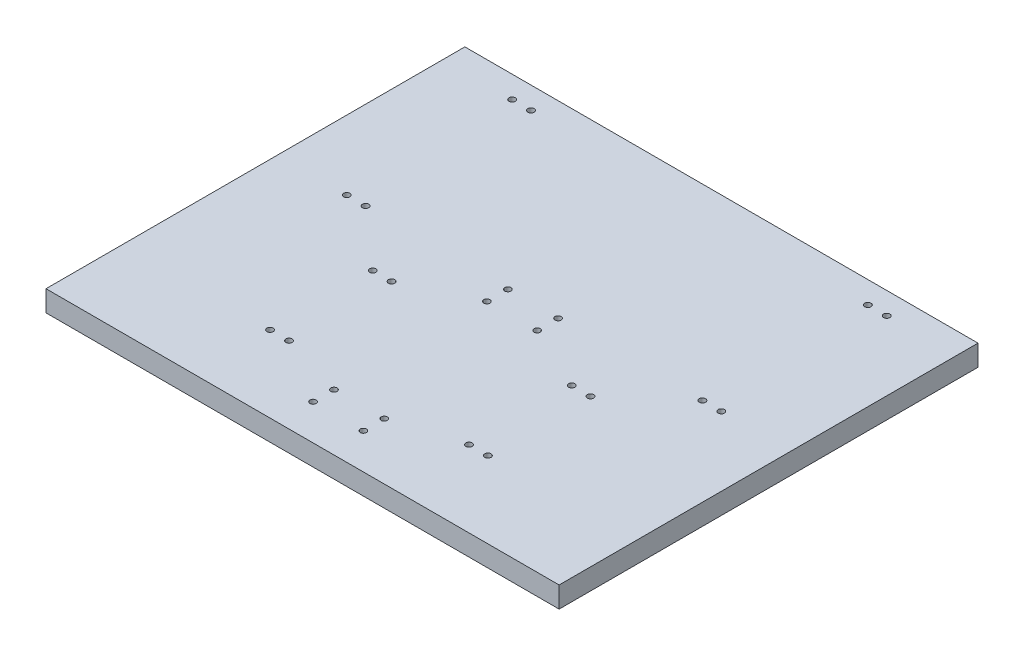
ISO-10303-21;
HEADER;
FILE_DESCRIPTION(('STEP AP214'),'2;1');
FILE_NAME('part.step','',(''),(''),'','','');
FILE_SCHEMA(('AUTOMOTIVE_DESIGN { 1 0 10303 214 1 1 1 1 }'));
ENDSEC;
DATA;
#1=APPLICATION_CONTEXT('core data for automotive mechanical design processes');
#2=APPLICATION_PROTOCOL_DEFINITION('international standard','automotive_design',2000,#1);
#3=PRODUCT_CONTEXT('',#1,'mechanical');
#4=PRODUCT('Part','Part','',(#3));
#5=PRODUCT_RELATED_PRODUCT_CATEGORY('part','',(#4));
#6=PRODUCT_DEFINITION_FORMATION('','',#4);
#7=PRODUCT_DEFINITION_CONTEXT('part definition',#1,'design');
#8=PRODUCT_DEFINITION('design','',#6,#7);
#9=PRODUCT_DEFINITION_SHAPE('','',#8);
#10=(LENGTH_UNIT() NAMED_UNIT(*) SI_UNIT(.MILLI.,.METRE.));
#11=(NAMED_UNIT(*) PLANE_ANGLE_UNIT() SI_UNIT($,.RADIAN.));
#12=(NAMED_UNIT(*) SI_UNIT($,.STERADIAN.) SOLID_ANGLE_UNIT());
#13=UNCERTAINTY_MEASURE_WITH_UNIT(LENGTH_MEASURE(1.E-05),#10,'distance_accuracy_value','');
#14=(GEOMETRIC_REPRESENTATION_CONTEXT(3) GLOBAL_UNCERTAINTY_ASSIGNED_CONTEXT((#13)) GLOBAL_UNIT_ASSIGNED_CONTEXT((#10,
#11,#12)) REPRESENTATION_CONTEXT('',''));
#15=CARTESIAN_POINT('',(0.,0.,0.));
#16=DIRECTION('',(0.,0.,1.));
#17=DIRECTION('',(1.,0.,0.));
#18=AXIS2_PLACEMENT_3D('',#15,#16,#17);
#19=CARTESIAN_POINT('',(0.,10.,0.));
#20=DIRECTION('',(1.,0.,0.));
#21=DIRECTION('',(0.,0.,-1.));
#22=AXIS2_PLACEMENT_3D('',#19,#20,#21);
#23=PLANE('',#22);
#24=DIRECTION('',(0.,0.,1.));
#25=VECTOR('',#24,1.);
#26=CARTESIAN_POINT('',(0.,0.,0.));
#27=LINE('',#26,#25);
#28=CARTESIAN_POINT('',(0.,0.,-200.));
#29=VERTEX_POINT('',#28);
#30=CARTESIAN_POINT('',(0.,0.,0.));
#31=VERTEX_POINT('',#30);
#32=EDGE_CURVE('E86',#29,#31,#27,.T.);
#33=ORIENTED_EDGE('',*,*,#32,.T.);
#34=DIRECTION('',(0.,-1.,0.));
#35=VECTOR('',#34,1.);
#36=CARTESIAN_POINT('',(0.,10.,0.));
#37=LINE('',#36,#35);
#38=CARTESIAN_POINT('',(0.,10.,0.));
#39=VERTEX_POINT('',#38);
#40=EDGE_CURVE('E11',#39,#31,#37,.T.);
#41=ORIENTED_EDGE('',*,*,#40,.F.);
#42=DIRECTION('',(0.,0.,1.));
#43=VECTOR('',#42,1.);
#44=CARTESIAN_POINT('',(0.,10.,0.));
#45=LINE('',#44,#43);
#46=CARTESIAN_POINT('',(0.,10.,-200.));
#47=VERTEX_POINT('',#46);
#48=EDGE_CURVE('E88',#47,#39,#45,.T.);
#49=ORIENTED_EDGE('',*,*,#48,.F.);
#50=DIRECTION('',(0.,-1.,0.));
#51=VECTOR('',#50,1.);
#52=CARTESIAN_POINT('',(0.,10.,-200.));
#53=LINE('',#52,#51);
#54=EDGE_CURVE('E48',#47,#29,#53,.T.);
#55=ORIENTED_EDGE('',*,*,#54,.T.);
#56=EDGE_LOOP('',(#33,#41,#49,#55));
#57=FACE_BOUND('',#56,.T.);
#58=ADVANCED_FACE('F40',(#57),#23,.F.);
#59=CARTESIAN_POINT('',(0.,10.,0.));
#60=DIRECTION('',(0.,0.,-1.));
#61=DIRECTION('',(-1.,0.,0.));
#62=AXIS2_PLACEMENT_3D('',#59,#60,#61);
#63=PLANE('',#62);
#64=DIRECTION('',(1.,0.,0.));
#65=VECTOR('',#64,1.);
#66=CARTESIAN_POINT('',(0.,0.,0.));
#67=LINE('',#66,#65);
#68=CARTESIAN_POINT('',(245.,0.,0.));
#69=VERTEX_POINT('',#68);
#70=EDGE_CURVE('E68',#31,#69,#67,.T.);
#71=ORIENTED_EDGE('',*,*,#70,.T.);
#72=DIRECTION('',(0.,-1.,0.));
#73=VECTOR('',#72,1.);
#74=CARTESIAN_POINT('',(245.,10.,0.));
#75=LINE('',#74,#73);
#76=CARTESIAN_POINT('',(245.,10.,0.));
#77=VERTEX_POINT('',#76);
#78=EDGE_CURVE('E95',#77,#69,#75,.T.);
#79=ORIENTED_EDGE('',*,*,#78,.F.);
#80=DIRECTION('',(1.,0.,0.));
#81=VECTOR('',#80,1.);
#82=CARTESIAN_POINT('',(0.,10.,0.));
#83=LINE('',#82,#81);
#84=EDGE_CURVE('E159',#39,#77,#83,.T.);
#85=ORIENTED_EDGE('',*,*,#84,.F.);
#86=ORIENTED_EDGE('',*,*,#40,.T.);
#87=EDGE_LOOP('',(#71,#79,#85,#86));
#88=FACE_BOUND('',#87,.T.);
#89=ADVANCED_FACE('F169',(#88),#63,.F.);
#90=CARTESIAN_POINT('',(0.,10.,-200.));
#91=DIRECTION('',(0.,0.,1.));
#92=DIRECTION('',(1.,0.,0.));
#93=AXIS2_PLACEMENT_3D('',#90,#91,#92);
#94=PLANE('',#93);
#95=DIRECTION('',(-1.,0.,0.));
#96=VECTOR('',#95,1.);
#97=CARTESIAN_POINT('',(0.,0.,-200.));
#98=LINE('',#97,#96);
#99=CARTESIAN_POINT('',(245.,0.,-200.));
#100=VERTEX_POINT('',#99);
#101=EDGE_CURVE('E80',#100,#29,#98,.T.);
#102=ORIENTED_EDGE('',*,*,#101,.T.);
#103=ORIENTED_EDGE('',*,*,#54,.F.);
#104=DIRECTION('',(-1.,0.,0.));
#105=VECTOR('',#104,1.);
#106=CARTESIAN_POINT('',(0.,10.,-200.));
#107=LINE('',#106,#105);
#108=CARTESIAN_POINT('',(245.,10.,-200.));
#109=VERTEX_POINT('',#108);
#110=EDGE_CURVE('E56',#109,#47,#107,.T.);
#111=ORIENTED_EDGE('',*,*,#110,.F.);
#112=DIRECTION('',(0.,-1.,0.));
#113=VECTOR('',#112,1.);
#114=CARTESIAN_POINT('',(245.,10.,-200.));
#115=LINE('',#114,#113);
#116=EDGE_CURVE('E91',#109,#100,#115,.T.);
#117=ORIENTED_EDGE('',*,*,#116,.T.);
#118=EDGE_LOOP('',(#102,#103,#111,#117));
#119=FACE_BOUND('',#118,.T.);
#120=ADVANCED_FACE('F92',(#119),#94,.F.);
#121=CARTESIAN_POINT('',(0.,10.,0.));
#122=DIRECTION('',(0.,-1.,0.));
#123=DIRECTION('',(0.,0.,-1.));
#124=AXIS2_PLACEMENT_3D('',#121,#122,#123);
#125=PLANE('',#124);
#126=CARTESIAN_POINT('',(110.5,10.,-27.));
#127=DIRECTION('',(0.,1.,0.));
#128=DIRECTION('',(0.,0.,1.));
#129=AXIS2_PLACEMENT_3D('',#126,#127,#128);
#130=CIRCLE('',#129,1.475);
#131=CARTESIAN_POINT('',(110.5,10.,-25.525));
#132=VERTEX_POINT('',#131);
#133=EDGE_CURVE('E293',#132,#132,#130,.T.);
#134=ORIENTED_EDGE('',*,*,#133,.F.);
#135=EDGE_LOOP('',(#134));
#136=FACE_BOUND('',#135,.T.);
#137=CARTESIAN_POINT('',(134.5,10.,-100.));
#138=DIRECTION('',(0.,1.,0.));
#139=DIRECTION('',(0.,0.,1.));
#140=AXIS2_PLACEMENT_3D('',#137,#138,#139);
#141=CIRCLE('',#140,1.47500000000001);
#142=CARTESIAN_POINT('',(134.5,10.,-98.525));
#143=VERTEX_POINT('',#142);
#144=EDGE_CURVE('E309',#143,#143,#141,.T.);
#145=ORIENTED_EDGE('',*,*,#144,.F.);
#146=EDGE_LOOP('',(#145));
#147=FACE_BOUND('',#146,.T.);
#148=CARTESIAN_POINT('',(110.5,10.,-100.));
#149=DIRECTION('',(0.,1.,0.));
#150=DIRECTION('',(0.,0.,1.));
#151=AXIS2_PLACEMENT_3D('',#148,#149,#150);
#152=CIRCLE('',#151,1.475);
#153=CARTESIAN_POINT('',(110.5,10.,-98.525));
#154=VERTEX_POINT('',#153);
#155=EDGE_CURVE('E325',#154,#154,#152,.T.);
#156=ORIENTED_EDGE('',*,*,#155,.F.);
#157=EDGE_LOOP('',(#156));
#158=FACE_BOUND('',#157,.T.);
#159=CARTESIAN_POINT('',(110.5,10.,-110.));
#160=DIRECTION('',(0.,1.,0.));
#161=DIRECTION('',(0.,0.,1.));
#162=AXIS2_PLACEMENT_3D('',#159,#160,#161);
#163=CIRCLE('',#162,1.475);
#164=CARTESIAN_POINT('',(110.5,10.,-108.525));
#165=VERTEX_POINT('',#164);
#166=EDGE_CURVE('E318',#165,#165,#163,.T.);
#167=ORIENTED_EDGE('',*,*,#166,.F.);
#168=EDGE_LOOP('',(#167));
#169=FACE_BOUND('',#168,.T.);
#170=CARTESIAN_POINT('',(134.5,10.,-27.));
#171=DIRECTION('',(0.,1.,0.));
#172=DIRECTION('',(0.,0.,1.));
#173=AXIS2_PLACEMENT_3D('',#170,#171,#172);
#174=CIRCLE('',#173,1.47500000000001);
#175=CARTESIAN_POINT('',(134.5,10.,-25.525));
#176=VERTEX_POINT('',#175);
#177=EDGE_CURVE('E288',#176,#176,#174,.T.);
#178=ORIENTED_EDGE('',*,*,#177,.F.);
#179=EDGE_LOOP('',(#178));
#180=FACE_BOUND('',#179,.T.);
#181=CARTESIAN_POINT('',(134.5,10.,-17.));
#182=DIRECTION('',(0.,1.,0.));
#183=DIRECTION('',(0.,0.,1.));
#184=AXIS2_PLACEMENT_3D('',#181,#182,#183);
#185=CIRCLE('',#184,1.47500000000001);
#186=CARTESIAN_POINT('',(134.5,10.,-15.525));
#187=VERTEX_POINT('',#186);
#188=EDGE_CURVE('E295',#187,#187,#185,.T.);
#189=ORIENTED_EDGE('',*,*,#188,.F.);
#190=EDGE_LOOP('',(#189));
#191=FACE_BOUND('',#190,.T.);
#192=CARTESIAN_POINT('',(110.5,10.,-17.));
#193=DIRECTION('',(0.,1.,0.));
#194=DIRECTION('',(0.,0.,1.));
#195=AXIS2_PLACEMENT_3D('',#192,#193,#194);
#196=CIRCLE('',#195,1.475);
#197=CARTESIAN_POINT('',(110.5,10.,-15.525));
#198=VERTEX_POINT('',#197);
#199=EDGE_CURVE('E303',#198,#198,#196,.T.);
#200=ORIENTED_EDGE('',*,*,#199,.F.);
#201=EDGE_LOOP('',(#200));
#202=FACE_BOUND('',#201,.T.);
#203=CARTESIAN_POINT('',(134.5,10.,-110.));
#204=DIRECTION('',(0.,1.,0.));
#205=DIRECTION('',(0.,0.,1.));
#206=AXIS2_PLACEMENT_3D('',#203,#204,#205);
#207=CIRCLE('',#206,1.47500000000001);
#208=CARTESIAN_POINT('',(134.5,10.,-108.525));
#209=VERTEX_POINT('',#208);
#210=EDGE_CURVE('E321',#209,#209,#207,.T.);
#211=ORIENTED_EDGE('',*,*,#210,.F.);
#212=EDGE_LOOP('',(#211));
#213=FACE_BOUND('',#212,.T.);
#214=CARTESIAN_POINT('',(70.5,10.,-85.5));
#215=DIRECTION('',(0.,1.,0.));
#216=DIRECTION('',(0.,0.,1.));
#217=AXIS2_PLACEMENT_3D('',#214,#215,#216);
#218=CIRCLE('',#217,1.5);
#219=CARTESIAN_POINT('',(70.5,10.,-84.));
#220=VERTEX_POINT('',#219);
#221=EDGE_CURVE('E136',#220,#220,#218,.T.);
#222=ORIENTED_EDGE('',*,*,#221,.F.);
#223=EDGE_LOOP('',(#222));
#224=FACE_BOUND('',#223,.T.);
#225=CARTESIAN_POINT('',(42.0749999999999,10.,-110.5));
#226=DIRECTION('',(0.,1.,0.));
#227=DIRECTION('',(0.,0.,1.));
#228=AXIS2_PLACEMENT_3D('',#225,#226,#227);
#229=CIRCLE('',#228,1.5);
#230=CARTESIAN_POINT('',(42.0749999999999,10.,-109.));
#231=VERTEX_POINT('',#230);
#232=EDGE_CURVE('E129',#231,#231,#229,.T.);
#233=ORIENTED_EDGE('',*,*,#232,.F.);
#234=EDGE_LOOP('',(#233));
#235=FACE_BOUND('',#234,.T.);
#236=CARTESIAN_POINT('',(33.0749999999999,10.,-110.5));
#237=DIRECTION('',(0.,1.,0.));
#238=DIRECTION('',(0.,0.,1.));
#239=AXIS2_PLACEMENT_3D('',#236,#237,#238);
#240=CIRCLE('',#239,1.5);
#241=CARTESIAN_POINT('',(33.0749999999999,10.,-109.));
#242=VERTEX_POINT('',#241);
#243=EDGE_CURVE('E148',#242,#242,#240,.T.);
#244=ORIENTED_EDGE('',*,*,#243,.F.);
#245=EDGE_LOOP('',(#244));
#246=FACE_BOUND('',#245,.T.);
#247=CARTESIAN_POINT('',(42.0749999999999,10.,-189.5));
#248=DIRECTION('',(0.,1.,0.));
#249=DIRECTION('',(0.,0.,1.));
#250=AXIS2_PLACEMENT_3D('',#247,#248,#249);
#251=CIRCLE('',#250,1.5);
#252=CARTESIAN_POINT('',(42.0749999999999,10.,-188.));
#253=VERTEX_POINT('',#252);
#254=EDGE_CURVE('E141',#253,#253,#251,.T.);
#255=ORIENTED_EDGE('',*,*,#254,.F.);
#256=EDGE_LOOP('',(#255));
#257=FACE_BOUND('',#256,.T.);
#258=CARTESIAN_POINT('',(79.5,10.,-36.5));
#259=DIRECTION('',(0.,1.,0.));
#260=DIRECTION('',(0.,0.,1.));
#261=AXIS2_PLACEMENT_3D('',#258,#259,#260);
#262=CIRCLE('',#261,1.5);
#263=CARTESIAN_POINT('',(79.5,10.,-35.));
#264=VERTEX_POINT('',#263);
#265=EDGE_CURVE('E111',#264,#264,#262,.T.);
#266=ORIENTED_EDGE('',*,*,#265,.F.);
#267=EDGE_LOOP('',(#266));
#268=FACE_BOUND('',#267,.T.);
#269=CARTESIAN_POINT('',(70.5,10.,-36.5));
#270=DIRECTION('',(0.,1.,0.));
#271=DIRECTION('',(0.,0.,1.));
#272=AXIS2_PLACEMENT_3D('',#269,#270,#271);
#273=CIRCLE('',#272,1.5);
#274=CARTESIAN_POINT('',(70.5,10.,-35.));
#275=VERTEX_POINT('',#274);
#276=EDGE_CURVE('E124',#275,#275,#273,.T.);
#277=ORIENTED_EDGE('',*,*,#276,.F.);
#278=EDGE_LOOP('',(#277));
#279=FACE_BOUND('',#278,.T.);
#280=CARTESIAN_POINT('',(79.5,10.,-85.5));
#281=DIRECTION('',(0.,1.,0.));
#282=DIRECTION('',(0.,0.,1.));
#283=AXIS2_PLACEMENT_3D('',#280,#281,#282);
#284=CIRCLE('',#283,1.5);
#285=CARTESIAN_POINT('',(79.5,10.,-84.));
#286=VERTEX_POINT('',#285);
#287=EDGE_CURVE('E117',#286,#286,#284,.T.);
#288=ORIENTED_EDGE('',*,*,#287,.F.);
#289=EDGE_LOOP('',(#288));
#290=FACE_BOUND('',#289,.T.);
#291=CARTESIAN_POINT('',(33.075,10.,-189.5));
#292=DIRECTION('',(0.,1.,0.));
#293=DIRECTION('',(0.,0.,1.));
#294=AXIS2_PLACEMENT_3D('',#291,#292,#293);
#295=CIRCLE('',#294,1.5);
#296=CARTESIAN_POINT('',(33.075,10.,-188.));
#297=VERTEX_POINT('',#296);
#298=EDGE_CURVE('E144',#297,#297,#295,.T.);
#299=ORIENTED_EDGE('',*,*,#298,.F.);
#300=EDGE_LOOP('',(#299));
#301=FACE_BOUND('',#300,.T.);
#302=ORIENTED_EDGE('',*,*,#48,.T.);
#303=ORIENTED_EDGE('',*,*,#84,.T.);
#304=DIRECTION('',(0.,0.,1.));
#305=VECTOR('',#304,1.);
#306=CARTESIAN_POINT('',(245.,10.,0.));
#307=LINE('',#306,#305);
#308=EDGE_CURVE('E96',#109,#77,#307,.T.);
#309=ORIENTED_EDGE('',*,*,#308,.F.);
#310=ORIENTED_EDGE('',*,*,#110,.T.);
#311=EDGE_LOOP('',(#302,#303,#309,#310));
#312=FACE_BOUND('',#311,.T.);
#313=CARTESIAN_POINT('',(174.5,10.,-85.5));
#314=DIRECTION('',(0.,-1.,0.));
#315=DIRECTION('',(0.,0.,1.));
#316=AXIS2_PLACEMENT_3D('',#313,#314,#315);
#317=CIRCLE('',#316,1.5);
#318=CARTESIAN_POINT('',(174.5,10.,-84.));
#319=VERTEX_POINT('',#318);
#320=EDGE_CURVE('E361',#319,#319,#317,.T.);
#321=ORIENTED_EDGE('',*,*,#320,.T.);
#322=EDGE_LOOP('',(#321));
#323=FACE_BOUND('',#322,.T.);
#324=CARTESIAN_POINT('',(202.925,10.,-110.5));
#325=DIRECTION('',(0.,-1.,0.));
#326=DIRECTION('',(0.,0.,1.));
#327=AXIS2_PLACEMENT_3D('',#324,#325,#326);
#328=CIRCLE('',#327,1.5);
#329=CARTESIAN_POINT('',(202.925,10.,-109.));
#330=VERTEX_POINT('',#329);
#331=EDGE_CURVE('E354',#330,#330,#328,.T.);
#332=ORIENTED_EDGE('',*,*,#331,.T.);
#333=EDGE_LOOP('',(#332));
#334=FACE_BOUND('',#333,.T.);
#335=CARTESIAN_POINT('',(211.925,10.,-110.5));
#336=DIRECTION('',(0.,-1.,0.));
#337=DIRECTION('',(0.,0.,1.));
#338=AXIS2_PLACEMENT_3D('',#335,#336,#337);
#339=CIRCLE('',#338,1.5);
#340=CARTESIAN_POINT('',(211.925,10.,-109.));
#341=VERTEX_POINT('',#340);
#342=EDGE_CURVE('E372',#341,#341,#339,.T.);
#343=ORIENTED_EDGE('',*,*,#342,.T.);
#344=EDGE_LOOP('',(#343));
#345=FACE_BOUND('',#344,.T.);
#346=CARTESIAN_POINT('',(202.925,10.,-189.5));
#347=DIRECTION('',(0.,-1.,0.));
#348=DIRECTION('',(0.,0.,1.));
#349=AXIS2_PLACEMENT_3D('',#346,#347,#348);
#350=CIRCLE('',#349,1.5);
#351=CARTESIAN_POINT('',(202.925,10.,-188.));
#352=VERTEX_POINT('',#351);
#353=EDGE_CURVE('E366',#352,#352,#350,.T.);
#354=ORIENTED_EDGE('',*,*,#353,.T.);
#355=EDGE_LOOP('',(#354));
#356=FACE_BOUND('',#355,.T.);
#357=CARTESIAN_POINT('',(165.5,10.,-36.5));
#358=DIRECTION('',(0.,-1.,0.));
#359=DIRECTION('',(0.,0.,1.));
#360=AXIS2_PLACEMENT_3D('',#357,#358,#359);
#361=CIRCLE('',#360,1.5);
#362=CARTESIAN_POINT('',(165.5,10.,-35.));
#363=VERTEX_POINT('',#362);
#364=EDGE_CURVE('E336',#363,#363,#361,.T.);
#365=ORIENTED_EDGE('',*,*,#364,.T.);
#366=EDGE_LOOP('',(#365));
#367=FACE_BOUND('',#366,.T.);
#368=CARTESIAN_POINT('',(174.5,10.,-36.5));
#369=DIRECTION('',(0.,-1.,0.));
#370=DIRECTION('',(0.,0.,1.));
#371=AXIS2_PLACEMENT_3D('',#368,#369,#370);
#372=CIRCLE('',#371,1.5);
#373=CARTESIAN_POINT('',(174.5,10.,-35.));
#374=VERTEX_POINT('',#373);
#375=EDGE_CURVE('E349',#374,#374,#372,.T.);
#376=ORIENTED_EDGE('',*,*,#375,.T.);
#377=EDGE_LOOP('',(#376));
#378=FACE_BOUND('',#377,.T.);
#379=CARTESIAN_POINT('',(165.5,10.,-85.5));
#380=DIRECTION('',(0.,-1.,0.));
#381=DIRECTION('',(0.,0.,1.));
#382=AXIS2_PLACEMENT_3D('',#379,#380,#381);
#383=CIRCLE('',#382,1.5);
#384=CARTESIAN_POINT('',(165.5,10.,-84.));
#385=VERTEX_POINT('',#384);
#386=EDGE_CURVE('E342',#385,#385,#383,.T.);
#387=ORIENTED_EDGE('',*,*,#386,.T.);
#388=EDGE_LOOP('',(#387));
#389=FACE_BOUND('',#388,.T.);
#390=CARTESIAN_POINT('',(211.925,10.,-189.5));
#391=DIRECTION('',(0.,-1.,0.));
#392=DIRECTION('',(0.,0.,1.));
#393=AXIS2_PLACEMENT_3D('',#390,#391,#392);
#394=CIRCLE('',#393,1.5);
#395=CARTESIAN_POINT('',(211.925,10.,-188.));
#396=VERTEX_POINT('',#395);
#397=EDGE_CURVE('E105',#396,#396,#394,.T.);
#398=ORIENTED_EDGE('',*,*,#397,.T.);
#399=EDGE_LOOP('',(#398));
#400=FACE_BOUND('',#399,.T.);
#401=ADVANCED_FACE('F166',(#136,#147,#158,#169,#180,#191,#202,#213,#224,#235,#246,#257,#268,
#279,#290,#301,#312,#323,#334,#345,#356,#367,#378,#389,#400),#125,.F.);
#402=CARTESIAN_POINT('',(0.,0.,0.));
#403=DIRECTION('',(0.,-1.,0.));
#404=DIRECTION('',(0.,0.,-1.));
#405=AXIS2_PLACEMENT_3D('',#402,#403,#404);
#406=PLANE('',#405);
#407=CARTESIAN_POINT('',(110.5,0.,-27.));
#408=DIRECTION('',(0.,1.,0.));
#409=DIRECTION('',(0.,0.,1.));
#410=AXIS2_PLACEMENT_3D('',#407,#408,#409);
#411=CIRCLE('',#410,1.475);
#412=CARTESIAN_POINT('',(110.5,0.,-25.525));
#413=VERTEX_POINT('',#412);
#414=EDGE_CURVE('E290',#413,#413,#411,.T.);
#415=ORIENTED_EDGE('',*,*,#414,.T.);
#416=EDGE_LOOP('',(#415));
#417=FACE_BOUND('',#416,.T.);
#418=CARTESIAN_POINT('',(134.5,0.,-100.));
#419=DIRECTION('',(0.,1.,0.));
#420=DIRECTION('',(0.,0.,1.));
#421=AXIS2_PLACEMENT_3D('',#418,#419,#420);
#422=CIRCLE('',#421,1.47500000000001);
#423=CARTESIAN_POINT('',(134.5,0.,-98.525));
#424=VERTEX_POINT('',#423);
#425=EDGE_CURVE('E313',#424,#424,#422,.T.);
#426=ORIENTED_EDGE('',*,*,#425,.T.);
#427=EDGE_LOOP('',(#426));
#428=FACE_BOUND('',#427,.T.);
#429=CARTESIAN_POINT('',(110.5,0.,-100.));
#430=DIRECTION('',(0.,1.,0.));
#431=DIRECTION('',(0.,0.,1.));
#432=AXIS2_PLACEMENT_3D('',#429,#430,#431);
#433=CIRCLE('',#432,1.475);
#434=CARTESIAN_POINT('',(110.5,0.,-98.525));
#435=VERTEX_POINT('',#434);
#436=EDGE_CURVE('E312',#435,#435,#433,.T.);
#437=ORIENTED_EDGE('',*,*,#436,.T.);
#438=EDGE_LOOP('',(#437));
#439=FACE_BOUND('',#438,.T.);
#440=CARTESIAN_POINT('',(110.5,0.,-110.));
#441=DIRECTION('',(0.,1.,0.));
#442=DIRECTION('',(0.,0.,1.));
#443=AXIS2_PLACEMENT_3D('',#440,#441,#442);
#444=CIRCLE('',#443,1.475);
#445=CARTESIAN_POINT('',(110.5,0.,-108.525));
#446=VERTEX_POINT('',#445);
#447=EDGE_CURVE('E322',#446,#446,#444,.T.);
#448=ORIENTED_EDGE('',*,*,#447,.T.);
#449=EDGE_LOOP('',(#448));
#450=FACE_BOUND('',#449,.T.);
#451=CARTESIAN_POINT('',(134.5,0.,-27.));
#452=DIRECTION('',(0.,1.,0.));
#453=DIRECTION('',(0.,0.,1.));
#454=AXIS2_PLACEMENT_3D('',#451,#452,#453);
#455=CIRCLE('',#454,1.47500000000001);
#456=CARTESIAN_POINT('',(134.5,0.,-25.525));
#457=VERTEX_POINT('',#456);
#458=EDGE_CURVE('E285',#457,#457,#455,.T.);
#459=ORIENTED_EDGE('',*,*,#458,.T.);
#460=EDGE_LOOP('',(#459));
#461=FACE_BOUND('',#460,.T.);
#462=CARTESIAN_POINT('',(134.5,0.,-17.));
#463=DIRECTION('',(0.,1.,0.));
#464=DIRECTION('',(0.,0.,1.));
#465=AXIS2_PLACEMENT_3D('',#462,#463,#464);
#466=CIRCLE('',#465,1.47500000000001);
#467=CARTESIAN_POINT('',(134.5,0.,-15.525));
#468=VERTEX_POINT('',#467);
#469=EDGE_CURVE('E300',#468,#468,#466,.T.);
#470=ORIENTED_EDGE('',*,*,#469,.T.);
#471=EDGE_LOOP('',(#470));
#472=FACE_BOUND('',#471,.T.);
#473=CARTESIAN_POINT('',(110.5,0.,-17.));
#474=DIRECTION('',(0.,1.,0.));
#475=DIRECTION('',(0.,0.,1.));
#476=AXIS2_PLACEMENT_3D('',#473,#474,#475);
#477=CIRCLE('',#476,1.475);
#478=CARTESIAN_POINT('',(110.5,0.,-15.525));
#479=VERTEX_POINT('',#478);
#480=EDGE_CURVE('E306',#479,#479,#477,.T.);
#481=ORIENTED_EDGE('',*,*,#480,.T.);
#482=EDGE_LOOP('',(#481));
#483=FACE_BOUND('',#482,.T.);
#484=CARTESIAN_POINT('',(134.5,0.,-110.));
#485=DIRECTION('',(0.,1.,0.));
#486=DIRECTION('',(0.,0.,1.));
#487=AXIS2_PLACEMENT_3D('',#484,#485,#486);
#488=CIRCLE('',#487,1.47500000000001);
#489=CARTESIAN_POINT('',(134.5,0.,-108.525));
#490=VERTEX_POINT('',#489);
#491=EDGE_CURVE('E330',#490,#490,#488,.T.);
#492=ORIENTED_EDGE('',*,*,#491,.T.);
#493=EDGE_LOOP('',(#492));
#494=FACE_BOUND('',#493,.T.);
#495=CARTESIAN_POINT('',(70.5,0.,-85.5));
#496=DIRECTION('',(0.,1.,0.));
#497=DIRECTION('',(0.,0.,1.));
#498=AXIS2_PLACEMENT_3D('',#495,#496,#497);
#499=CIRCLE('',#498,1.5);
#500=CARTESIAN_POINT('',(70.5,0.,-84.));
#501=VERTEX_POINT('',#500);
#502=EDGE_CURVE('E120',#501,#501,#499,.T.);
#503=ORIENTED_EDGE('',*,*,#502,.T.);
#504=EDGE_LOOP('',(#503));
#505=FACE_BOUND('',#504,.T.);
#506=CARTESIAN_POINT('',(42.0749999999999,0.,-110.5));
#507=DIRECTION('',(0.,1.,0.));
#508=DIRECTION('',(0.,0.,1.));
#509=AXIS2_PLACEMENT_3D('',#506,#507,#508);
#510=CIRCLE('',#509,1.5);
#511=CARTESIAN_POINT('',(42.0749999999999,0.,-109.));
#512=VERTEX_POINT('',#511);
#513=EDGE_CURVE('E133',#512,#512,#510,.T.);
#514=ORIENTED_EDGE('',*,*,#513,.T.);
#515=EDGE_LOOP('',(#514));
#516=FACE_BOUND('',#515,.T.);
#517=CARTESIAN_POINT('',(33.0749999999999,0.,-110.5));
#518=DIRECTION('',(0.,1.,0.));
#519=DIRECTION('',(0.,0.,1.));
#520=AXIS2_PLACEMENT_3D('',#517,#518,#519);
#521=CIRCLE('',#520,1.5);
#522=CARTESIAN_POINT('',(33.0749999999999,0.,-109.));
#523=VERTEX_POINT('',#522);
#524=EDGE_CURVE('E132',#523,#523,#521,.T.);
#525=ORIENTED_EDGE('',*,*,#524,.T.);
#526=EDGE_LOOP('',(#525));
#527=FACE_BOUND('',#526,.T.);
#528=CARTESIAN_POINT('',(42.0749999999999,0.,-189.5));
#529=DIRECTION('',(0.,1.,0.));
#530=DIRECTION('',(0.,0.,1.));
#531=AXIS2_PLACEMENT_3D('',#528,#529,#530);
#532=CIRCLE('',#531,1.5);
#533=CARTESIAN_POINT('',(42.0749999999999,0.,-188.));
#534=VERTEX_POINT('',#533);
#535=EDGE_CURVE('E145',#534,#534,#532,.T.);
#536=ORIENTED_EDGE('',*,*,#535,.T.);
#537=EDGE_LOOP('',(#536));
#538=FACE_BOUND('',#537,.T.);
#539=CARTESIAN_POINT('',(79.5,0.,-36.5));
#540=DIRECTION('',(0.,1.,0.));
#541=DIRECTION('',(0.,0.,1.));
#542=AXIS2_PLACEMENT_3D('',#539,#540,#541);
#543=CIRCLE('',#542,1.5);
#544=CARTESIAN_POINT('',(79.5,0.,-35.));
#545=VERTEX_POINT('',#544);
#546=EDGE_CURVE('E110',#545,#545,#543,.T.);
#547=ORIENTED_EDGE('',*,*,#546,.T.);
#548=EDGE_LOOP('',(#547));
#549=FACE_BOUND('',#548,.T.);
#550=CARTESIAN_POINT('',(70.5,0.,-36.5));
#551=DIRECTION('',(0.,1.,0.));
#552=DIRECTION('',(0.,0.,1.));
#553=AXIS2_PLACEMENT_3D('',#550,#551,#552);
#554=CIRCLE('',#553,1.5);
#555=CARTESIAN_POINT('',(70.5,0.,-35.));
#556=VERTEX_POINT('',#555);
#557=EDGE_CURVE('E114',#556,#556,#554,.T.);
#558=ORIENTED_EDGE('',*,*,#557,.T.);
#559=EDGE_LOOP('',(#558));
#560=FACE_BOUND('',#559,.T.);
#561=CARTESIAN_POINT('',(79.5,0.,-85.5));
#562=DIRECTION('',(0.,1.,0.));
#563=DIRECTION('',(0.,0.,1.));
#564=AXIS2_PLACEMENT_3D('',#561,#562,#563);
#565=CIRCLE('',#564,1.5);
#566=CARTESIAN_POINT('',(79.5,0.,-84.));
#567=VERTEX_POINT('',#566);
#568=EDGE_CURVE('E121',#567,#567,#565,.T.);
#569=ORIENTED_EDGE('',*,*,#568,.T.);
#570=EDGE_LOOP('',(#569));
#571=FACE_BOUND('',#570,.T.);
#572=CARTESIAN_POINT('',(33.075,0.,-189.5));
#573=DIRECTION('',(0.,1.,0.));
#574=DIRECTION('',(0.,0.,1.));
#575=AXIS2_PLACEMENT_3D('',#572,#573,#574);
#576=CIRCLE('',#575,1.5);
#577=CARTESIAN_POINT('',(33.075,0.,-188.));
#578=VERTEX_POINT('',#577);
#579=EDGE_CURVE('E153',#578,#578,#576,.T.);
#580=ORIENTED_EDGE('',*,*,#579,.T.);
#581=EDGE_LOOP('',(#580));
#582=FACE_BOUND('',#581,.T.);
#583=ORIENTED_EDGE('',*,*,#32,.F.);
#584=ORIENTED_EDGE('',*,*,#101,.F.);
#585=DIRECTION('',(0.,0.,1.));
#586=VECTOR('',#585,1.);
#587=CARTESIAN_POINT('',(245.,0.,0.));
#588=LINE('',#587,#586);
#589=EDGE_CURVE('E84',#100,#69,#588,.T.);
#590=ORIENTED_EDGE('',*,*,#589,.T.);
#591=ORIENTED_EDGE('',*,*,#70,.F.);
#592=EDGE_LOOP('',(#583,#584,#590,#591));
#593=FACE_BOUND('',#592,.T.);
#594=CARTESIAN_POINT('',(174.5,0.,-85.5));
#595=DIRECTION('',(0.,-1.,0.));
#596=DIRECTION('',(0.,0.,1.));
#597=AXIS2_PLACEMENT_3D('',#594,#595,#596);
#598=CIRCLE('',#597,1.5);
#599=CARTESIAN_POINT('',(174.5,0.,-84.));
#600=VERTEX_POINT('',#599);
#601=EDGE_CURVE('E345',#600,#600,#598,.T.);
#602=ORIENTED_EDGE('',*,*,#601,.F.);
#603=EDGE_LOOP('',(#602));
#604=FACE_BOUND('',#603,.T.);
#605=CARTESIAN_POINT('',(202.925,0.,-110.5));
#606=DIRECTION('',(0.,-1.,0.));
#607=DIRECTION('',(0.,0.,1.));
#608=AXIS2_PLACEMENT_3D('',#605,#606,#607);
#609=CIRCLE('',#608,1.5);
#610=CARTESIAN_POINT('',(202.925,0.,-109.));
#611=VERTEX_POINT('',#610);
#612=EDGE_CURVE('E358',#611,#611,#609,.T.);
#613=ORIENTED_EDGE('',*,*,#612,.F.);
#614=EDGE_LOOP('',(#613));
#615=FACE_BOUND('',#614,.T.);
#616=CARTESIAN_POINT('',(211.925,0.,-110.5));
#617=DIRECTION('',(0.,-1.,0.));
#618=DIRECTION('',(0.,0.,1.));
#619=AXIS2_PLACEMENT_3D('',#616,#617,#618);
#620=CIRCLE('',#619,1.5);
#621=CARTESIAN_POINT('',(211.925,0.,-109.));
#622=VERTEX_POINT('',#621);
#623=EDGE_CURVE('E357',#622,#622,#620,.T.);
#624=ORIENTED_EDGE('',*,*,#623,.F.);
#625=EDGE_LOOP('',(#624));
#626=FACE_BOUND('',#625,.T.);
#627=CARTESIAN_POINT('',(202.925,0.,-189.5));
#628=DIRECTION('',(0.,-1.,0.));
#629=DIRECTION('',(0.,0.,1.));
#630=AXIS2_PLACEMENT_3D('',#627,#628,#629);
#631=CIRCLE('',#630,1.5);
#632=CARTESIAN_POINT('',(202.925,0.,-188.));
#633=VERTEX_POINT('',#632);
#634=EDGE_CURVE('E369',#633,#633,#631,.T.);
#635=ORIENTED_EDGE('',*,*,#634,.F.);
#636=EDGE_LOOP('',(#635));
#637=FACE_BOUND('',#636,.T.);
#638=CARTESIAN_POINT('',(165.5,0.,-36.5));
#639=DIRECTION('',(0.,-1.,0.));
#640=DIRECTION('',(0.,0.,1.));
#641=AXIS2_PLACEMENT_3D('',#638,#639,#640);
#642=CIRCLE('',#641,1.5);
#643=CARTESIAN_POINT('',(165.5,0.,-35.));
#644=VERTEX_POINT('',#643);
#645=EDGE_CURVE('E333',#644,#644,#642,.T.);
#646=ORIENTED_EDGE('',*,*,#645,.F.);
#647=EDGE_LOOP('',(#646));
#648=FACE_BOUND('',#647,.T.);
#649=CARTESIAN_POINT('',(174.5,0.,-36.5));
#650=DIRECTION('',(0.,-1.,0.));
#651=DIRECTION('',(0.,0.,1.));
#652=AXIS2_PLACEMENT_3D('',#649,#650,#651);
#653=CIRCLE('',#652,1.5);
#654=CARTESIAN_POINT('',(174.5,0.,-35.));
#655=VERTEX_POINT('',#654);
#656=EDGE_CURVE('E339',#655,#655,#653,.T.);
#657=ORIENTED_EDGE('',*,*,#656,.F.);
#658=EDGE_LOOP('',(#657));
#659=FACE_BOUND('',#658,.T.);
#660=CARTESIAN_POINT('',(165.5,0.,-85.5));
#661=DIRECTION('',(0.,-1.,0.));
#662=DIRECTION('',(0.,0.,1.));
#663=AXIS2_PLACEMENT_3D('',#660,#661,#662);
#664=CIRCLE('',#663,1.5);
#665=CARTESIAN_POINT('',(165.5,0.,-84.));
#666=VERTEX_POINT('',#665);
#667=EDGE_CURVE('E346',#666,#666,#664,.T.);
#668=ORIENTED_EDGE('',*,*,#667,.F.);
#669=EDGE_LOOP('',(#668));
#670=FACE_BOUND('',#669,.T.);
#671=CARTESIAN_POINT('',(211.925,0.,-189.5));
#672=DIRECTION('',(0.,-1.,0.));
#673=DIRECTION('',(0.,0.,1.));
#674=AXIS2_PLACEMENT_3D('',#671,#672,#673);
#675=CIRCLE('',#674,1.5);
#676=CARTESIAN_POINT('',(211.925,0.,-188.));
#677=VERTEX_POINT('',#676);
#678=EDGE_CURVE('E101',#677,#677,#675,.T.);
#679=ORIENTED_EDGE('',*,*,#678,.F.);
#680=EDGE_LOOP('',(#679));
#681=FACE_BOUND('',#680,.T.);
#682=ADVANCED_FACE('F81',(#417,#428,#439,#450,#461,#472,#483,#494,#505,#516,#527,#538,#549,#560,
#571,#582,#593,#604,#615,#626,#637,#648,#659,#670,#681),#406,.T.);
#683=CARTESIAN_POINT('',(33.075,0.,-189.5));
#684=DIRECTION('',(0.,1.,0.));
#685=DIRECTION('',(0.,0.,1.));
#686=AXIS2_PLACEMENT_3D('',#683,#684,#685);
#687=CYLINDRICAL_SURFACE('',#686,1.5);
#688=ORIENTED_EDGE('',*,*,#579,.F.);
#689=EDGE_LOOP('',(#688));
#690=FACE_BOUND('',#689,.T.);
#691=ORIENTED_EDGE('',*,*,#298,.T.);
#692=EDGE_LOOP('',(#691));
#693=FACE_BOUND('',#692,.T.);
#694=ADVANCED_FACE('F179',(#690,#693),#687,.F.);
#695=CARTESIAN_POINT('',(79.5,0.,-85.5));
#696=DIRECTION('',(0.,1.,0.));
#697=DIRECTION('',(0.,0.,1.));
#698=AXIS2_PLACEMENT_3D('',#695,#696,#697);
#699=CYLINDRICAL_SURFACE('',#698,1.5);
#700=ORIENTED_EDGE('',*,*,#568,.F.);
#701=EDGE_LOOP('',(#700));
#702=FACE_BOUND('',#701,.T.);
#703=ORIENTED_EDGE('',*,*,#287,.T.);
#704=EDGE_LOOP('',(#703));
#705=FACE_BOUND('',#704,.T.);
#706=ADVANCED_FACE('F186',(#702,#705),#699,.F.);
#707=CARTESIAN_POINT('',(70.5,0.,-36.5));
#708=DIRECTION('',(0.,1.,0.));
#709=DIRECTION('',(0.,0.,1.));
#710=AXIS2_PLACEMENT_3D('',#707,#708,#709);
#711=CYLINDRICAL_SURFACE('',#710,1.5);
#712=ORIENTED_EDGE('',*,*,#557,.F.);
#713=EDGE_LOOP('',(#712));
#714=FACE_BOUND('',#713,.T.);
#715=ORIENTED_EDGE('',*,*,#276,.T.);
#716=EDGE_LOOP('',(#715));
#717=FACE_BOUND('',#716,.T.);
#718=ADVANCED_FACE('F205',(#714,#717),#711,.F.);
#719=CARTESIAN_POINT('',(79.5,0.,-36.5));
#720=DIRECTION('',(0.,1.,0.));
#721=DIRECTION('',(0.,0.,1.));
#722=AXIS2_PLACEMENT_3D('',#719,#720,#721);
#723=CYLINDRICAL_SURFACE('',#722,1.5);
#724=ORIENTED_EDGE('',*,*,#546,.F.);
#725=EDGE_LOOP('',(#724));
#726=FACE_BOUND('',#725,.T.);
#727=ORIENTED_EDGE('',*,*,#265,.T.);
#728=EDGE_LOOP('',(#727));
#729=FACE_BOUND('',#728,.T.);
#730=ADVANCED_FACE('F196',(#726,#729),#723,.F.);
#731=CARTESIAN_POINT('',(42.0749999999999,0.,-189.5));
#732=DIRECTION('',(0.,1.,0.));
#733=DIRECTION('',(0.,0.,1.));
#734=AXIS2_PLACEMENT_3D('',#731,#732,#733);
#735=CYLINDRICAL_SURFACE('',#734,1.5);
#736=ORIENTED_EDGE('',*,*,#535,.F.);
#737=EDGE_LOOP('',(#736));
#738=FACE_BOUND('',#737,.T.);
#739=ORIENTED_EDGE('',*,*,#254,.T.);
#740=EDGE_LOOP('',(#739));
#741=FACE_BOUND('',#740,.T.);
#742=ADVANCED_FACE('F192',(#738,#741),#735,.F.);
#743=CARTESIAN_POINT('',(33.0749999999999,0.,-110.5));
#744=DIRECTION('',(0.,1.,0.));
#745=DIRECTION('',(0.,0.,1.));
#746=AXIS2_PLACEMENT_3D('',#743,#744,#745);
#747=CYLINDRICAL_SURFACE('',#746,1.5);
#748=ORIENTED_EDGE('',*,*,#524,.F.);
#749=EDGE_LOOP('',(#748));
#750=FACE_BOUND('',#749,.T.);
#751=ORIENTED_EDGE('',*,*,#243,.T.);
#752=EDGE_LOOP('',(#751));
#753=FACE_BOUND('',#752,.T.);
#754=ADVANCED_FACE('F188',(#750,#753),#747,.F.);
#755=CARTESIAN_POINT('',(42.0749999999999,0.,-110.5));
#756=DIRECTION('',(0.,1.,0.));
#757=DIRECTION('',(0.,0.,1.));
#758=AXIS2_PLACEMENT_3D('',#755,#756,#757);
#759=CYLINDRICAL_SURFACE('',#758,1.5);
#760=ORIENTED_EDGE('',*,*,#513,.F.);
#761=EDGE_LOOP('',(#760));
#762=FACE_BOUND('',#761,.T.);
#763=ORIENTED_EDGE('',*,*,#232,.T.);
#764=EDGE_LOOP('',(#763));
#765=FACE_BOUND('',#764,.T.);
#766=ADVANCED_FACE('F191',(#762,#765),#759,.F.);
#767=CARTESIAN_POINT('',(70.5,0.,-85.5));
#768=DIRECTION('',(0.,1.,0.));
#769=DIRECTION('',(0.,0.,1.));
#770=AXIS2_PLACEMENT_3D('',#767,#768,#769);
#771=CYLINDRICAL_SURFACE('',#770,1.5);
#772=ORIENTED_EDGE('',*,*,#502,.F.);
#773=EDGE_LOOP('',(#772));
#774=FACE_BOUND('',#773,.T.);
#775=ORIENTED_EDGE('',*,*,#221,.T.);
#776=EDGE_LOOP('',(#775));
#777=FACE_BOUND('',#776,.T.);
#778=ADVANCED_FACE('F198',(#774,#777),#771,.F.);
#779=CARTESIAN_POINT('',(245.,10.,0.));
#780=DIRECTION('',(-1.,0.,0.));
#781=DIRECTION('',(0.,0.,-1.));
#782=AXIS2_PLACEMENT_3D('',#779,#780,#781);
#783=PLANE('',#782);
#784=ORIENTED_EDGE('',*,*,#589,.F.);
#785=ORIENTED_EDGE('',*,*,#116,.F.);
#786=ORIENTED_EDGE('',*,*,#308,.T.);
#787=ORIENTED_EDGE('',*,*,#78,.T.);
#788=EDGE_LOOP('',(#784,#785,#786,#787));
#789=FACE_BOUND('',#788,.T.);
#790=ADVANCED_FACE('F99',(#789),#783,.F.);
#791=CARTESIAN_POINT('',(211.925,0.,-189.5));
#792=DIRECTION('',(0.,1.,0.));
#793=DIRECTION('',(0.,0.,1.));
#794=AXIS2_PLACEMENT_3D('',#791,#792,#793);
#795=CYLINDRICAL_SURFACE('',#794,1.5);
#796=ORIENTED_EDGE('',*,*,#678,.T.);
#797=EDGE_LOOP('',(#796));
#798=FACE_BOUND('',#797,.T.);
#799=ORIENTED_EDGE('',*,*,#397,.F.);
#800=EDGE_LOOP('',(#799));
#801=FACE_BOUND('',#800,.T.);
#802=ADVANCED_FACE('F217',(#798,#801),#795,.F.);
#803=CARTESIAN_POINT('',(165.5,0.,-85.5));
#804=DIRECTION('',(0.,1.,0.));
#805=DIRECTION('',(0.,0.,1.));
#806=AXIS2_PLACEMENT_3D('',#803,#804,#805);
#807=CYLINDRICAL_SURFACE('',#806,1.5);
#808=ORIENTED_EDGE('',*,*,#667,.T.);
#809=EDGE_LOOP('',(#808));
#810=FACE_BOUND('',#809,.T.);
#811=ORIENTED_EDGE('',*,*,#386,.F.);
#812=EDGE_LOOP('',(#811));
#813=FACE_BOUND('',#812,.T.);
#814=ADVANCED_FACE('F220',(#810,#813),#807,.F.);
#815=CARTESIAN_POINT('',(174.5,0.,-36.5));
#816=DIRECTION('',(0.,1.,0.));
#817=DIRECTION('',(0.,0.,1.));
#818=AXIS2_PLACEMENT_3D('',#815,#816,#817);
#819=CYLINDRICAL_SURFACE('',#818,1.5);
#820=ORIENTED_EDGE('',*,*,#656,.T.);
#821=EDGE_LOOP('',(#820));
#822=FACE_BOUND('',#821,.T.);
#823=ORIENTED_EDGE('',*,*,#375,.F.);
#824=EDGE_LOOP('',(#823));
#825=FACE_BOUND('',#824,.T.);
#826=ADVANCED_FACE('F240',(#822,#825),#819,.F.);
#827=CARTESIAN_POINT('',(165.5,0.,-36.5));
#828=DIRECTION('',(0.,1.,0.));
#829=DIRECTION('',(0.,0.,1.));
#830=AXIS2_PLACEMENT_3D('',#827,#828,#829);
#831=CYLINDRICAL_SURFACE('',#830,1.5);
#832=ORIENTED_EDGE('',*,*,#645,.T.);
#833=EDGE_LOOP('',(#832));
#834=FACE_BOUND('',#833,.T.);
#835=ORIENTED_EDGE('',*,*,#364,.F.);
#836=EDGE_LOOP('',(#835));
#837=FACE_BOUND('',#836,.T.);
#838=ADVANCED_FACE('F230',(#834,#837),#831,.F.);
#839=CARTESIAN_POINT('',(202.925,0.,-189.5));
#840=DIRECTION('',(0.,1.,0.));
#841=DIRECTION('',(0.,0.,1.));
#842=AXIS2_PLACEMENT_3D('',#839,#840,#841);
#843=CYLINDRICAL_SURFACE('',#842,1.5);
#844=ORIENTED_EDGE('',*,*,#634,.T.);
#845=EDGE_LOOP('',(#844));
#846=FACE_BOUND('',#845,.T.);
#847=ORIENTED_EDGE('',*,*,#353,.F.);
#848=EDGE_LOOP('',(#847));
#849=FACE_BOUND('',#848,.T.);
#850=ADVANCED_FACE('F226',(#846,#849),#843,.F.);
#851=CARTESIAN_POINT('',(211.925,0.,-110.5));
#852=DIRECTION('',(0.,1.,0.));
#853=DIRECTION('',(0.,0.,1.));
#854=AXIS2_PLACEMENT_3D('',#851,#852,#853);
#855=CYLINDRICAL_SURFACE('',#854,1.5);
#856=ORIENTED_EDGE('',*,*,#623,.T.);
#857=EDGE_LOOP('',(#856));
#858=FACE_BOUND('',#857,.T.);
#859=ORIENTED_EDGE('',*,*,#342,.F.);
#860=EDGE_LOOP('',(#859));
#861=FACE_BOUND('',#860,.T.);
#862=ADVANCED_FACE('F222',(#858,#861),#855,.F.);
#863=CARTESIAN_POINT('',(202.925,0.,-110.5));
#864=DIRECTION('',(0.,1.,0.));
#865=DIRECTION('',(0.,0.,1.));
#866=AXIS2_PLACEMENT_3D('',#863,#864,#865);
#867=CYLINDRICAL_SURFACE('',#866,1.5);
#868=ORIENTED_EDGE('',*,*,#612,.T.);
#869=EDGE_LOOP('',(#868));
#870=FACE_BOUND('',#869,.T.);
#871=ORIENTED_EDGE('',*,*,#331,.F.);
#872=EDGE_LOOP('',(#871));
#873=FACE_BOUND('',#872,.T.);
#874=ADVANCED_FACE('F225',(#870,#873),#867,.F.);
#875=CARTESIAN_POINT('',(174.5,0.,-85.5));
#876=DIRECTION('',(0.,1.,0.));
#877=DIRECTION('',(0.,0.,1.));
#878=AXIS2_PLACEMENT_3D('',#875,#876,#877);
#879=CYLINDRICAL_SURFACE('',#878,1.5);
#880=ORIENTED_EDGE('',*,*,#601,.T.);
#881=EDGE_LOOP('',(#880));
#882=FACE_BOUND('',#881,.T.);
#883=ORIENTED_EDGE('',*,*,#320,.F.);
#884=EDGE_LOOP('',(#883));
#885=FACE_BOUND('',#884,.T.);
#886=ADVANCED_FACE('F232',(#882,#885),#879,.F.);
#887=CARTESIAN_POINT('',(134.5,0.,-110.));
#888=DIRECTION('',(0.,1.,0.));
#889=DIRECTION('',(0.,0.,1.));
#890=AXIS2_PLACEMENT_3D('',#887,#888,#889);
#891=CYLINDRICAL_SURFACE('',#890,1.47500000000001);
#892=ORIENTED_EDGE('',*,*,#491,.F.);
#893=EDGE_LOOP('',(#892));
#894=FACE_BOUND('',#893,.T.);
#895=ORIENTED_EDGE('',*,*,#210,.T.);
#896=EDGE_LOOP('',(#895));
#897=FACE_BOUND('',#896,.T.);
#898=ADVANCED_FACE('F235',(#894,#897),#891,.F.);
#899=CARTESIAN_POINT('',(110.5,0.,-17.));
#900=DIRECTION('',(0.,1.,0.));
#901=DIRECTION('',(0.,0.,1.));
#902=AXIS2_PLACEMENT_3D('',#899,#900,#901);
#903=CYLINDRICAL_SURFACE('',#902,1.475);
#904=ORIENTED_EDGE('',*,*,#480,.F.);
#905=EDGE_LOOP('',(#904));
#906=FACE_BOUND('',#905,.T.);
#907=ORIENTED_EDGE('',*,*,#199,.T.);
#908=EDGE_LOOP('',(#907));
#909=FACE_BOUND('',#908,.T.);
#910=ADVANCED_FACE('F252',(#906,#909),#903,.F.);
#911=CARTESIAN_POINT('',(134.5,0.,-17.));
#912=DIRECTION('',(0.,1.,0.));
#913=DIRECTION('',(0.,0.,1.));
#914=AXIS2_PLACEMENT_3D('',#911,#912,#913);
#915=CYLINDRICAL_SURFACE('',#914,1.47500000000001);
#916=ORIENTED_EDGE('',*,*,#469,.F.);
#917=EDGE_LOOP('',(#916));
#918=FACE_BOUND('',#917,.T.);
#919=ORIENTED_EDGE('',*,*,#188,.T.);
#920=EDGE_LOOP('',(#919));
#921=FACE_BOUND('',#920,.T.);
#922=ADVANCED_FACE('F273',(#918,#921),#915,.F.);
#923=CARTESIAN_POINT('',(134.5,0.,-27.));
#924=DIRECTION('',(0.,1.,0.));
#925=DIRECTION('',(0.,0.,1.));
#926=AXIS2_PLACEMENT_3D('',#923,#924,#925);
#927=CYLINDRICAL_SURFACE('',#926,1.47500000000001);
#928=ORIENTED_EDGE('',*,*,#458,.F.);
#929=EDGE_LOOP('',(#928));
#930=FACE_BOUND('',#929,.T.);
#931=ORIENTED_EDGE('',*,*,#177,.T.);
#932=EDGE_LOOP('',(#931));
#933=FACE_BOUND('',#932,.T.);
#934=ADVANCED_FACE('F262',(#930,#933),#927,.F.);
#935=CARTESIAN_POINT('',(110.5,0.,-110.));
#936=DIRECTION('',(0.,1.,0.));
#937=DIRECTION('',(0.,0.,1.));
#938=AXIS2_PLACEMENT_3D('',#935,#936,#937);
#939=CYLINDRICAL_SURFACE('',#938,1.475);
#940=ORIENTED_EDGE('',*,*,#447,.F.);
#941=EDGE_LOOP('',(#940));
#942=FACE_BOUND('',#941,.T.);
#943=ORIENTED_EDGE('',*,*,#166,.T.);
#944=EDGE_LOOP('',(#943));
#945=FACE_BOUND('',#944,.T.);
#946=ADVANCED_FACE('F258',(#942,#945),#939,.F.);
#947=CARTESIAN_POINT('',(110.5,0.,-100.));
#948=DIRECTION('',(0.,1.,0.));
#949=DIRECTION('',(0.,0.,1.));
#950=AXIS2_PLACEMENT_3D('',#947,#948,#949);
#951=CYLINDRICAL_SURFACE('',#950,1.475);
#952=ORIENTED_EDGE('',*,*,#436,.F.);
#953=EDGE_LOOP('',(#952));
#954=FACE_BOUND('',#953,.T.);
#955=ORIENTED_EDGE('',*,*,#155,.T.);
#956=EDGE_LOOP('',(#955));
#957=FACE_BOUND('',#956,.T.);
#958=ADVANCED_FACE('F254',(#954,#957),#951,.F.);
#959=CARTESIAN_POINT('',(134.5,0.,-100.));
#960=DIRECTION('',(0.,1.,0.));
#961=DIRECTION('',(0.,0.,1.));
#962=AXIS2_PLACEMENT_3D('',#959,#960,#961);
#963=CYLINDRICAL_SURFACE('',#962,1.47500000000001);
#964=ORIENTED_EDGE('',*,*,#425,.F.);
#965=EDGE_LOOP('',(#964));
#966=FACE_BOUND('',#965,.T.);
#967=ORIENTED_EDGE('',*,*,#144,.T.);
#968=EDGE_LOOP('',(#967));
#969=FACE_BOUND('',#968,.T.);
#970=ADVANCED_FACE('F257',(#966,#969),#963,.F.);
#971=CARTESIAN_POINT('',(110.5,0.,-27.));
#972=DIRECTION('',(0.,1.,0.));
#973=DIRECTION('',(0.,0.,1.));
#974=AXIS2_PLACEMENT_3D('',#971,#972,#973);
#975=CYLINDRICAL_SURFACE('',#974,1.475);
#976=ORIENTED_EDGE('',*,*,#414,.F.);
#977=EDGE_LOOP('',(#976));
#978=FACE_BOUND('',#977,.T.);
#979=ORIENTED_EDGE('',*,*,#133,.T.);
#980=EDGE_LOOP('',(#979));
#981=FACE_BOUND('',#980,.T.);
#982=ADVANCED_FACE('F264',(#978,#981),#975,.F.);
#983=CLOSED_SHELL('',(#58,#89,#120,#401,#682,#694,#706,#718,#730,#742,#754,#766,#778,#790,#802,
#814,#826,#838,#850,#862,#874,#886,#898,#910,#922,#934,#946,#958,#970,#982));
#984=MANIFOLD_SOLID_BREP('B2',#983);
#985=ADVANCED_BREP_SHAPE_REPRESENTATION('',(#18,#984),#14);
#986=SHAPE_DEFINITION_REPRESENTATION(#9,#985);
ENDSEC;
END-ISO-10303-21;
